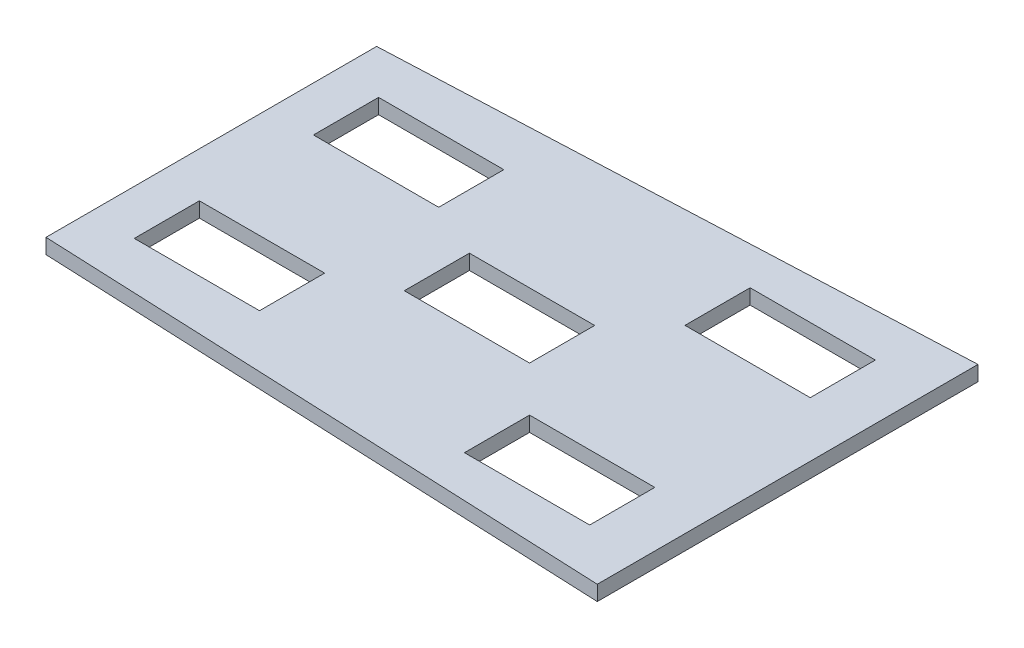
ISO-10303-21;
HEADER;
FILE_DESCRIPTION(('STEP AP214'),'2;1');
FILE_NAME('part.step','',(''),(''),'','','');
FILE_SCHEMA(('AUTOMOTIVE_DESIGN { 1 0 10303 214 1 1 1 1 }'));
ENDSEC;
DATA;
#1=APPLICATION_CONTEXT('core data for automotive mechanical design processes');
#2=APPLICATION_PROTOCOL_DEFINITION('international standard','automotive_design',2000,#1);
#3=PRODUCT_CONTEXT('',#1,'mechanical');
#4=PRODUCT('Part','Part','',(#3));
#5=PRODUCT_RELATED_PRODUCT_CATEGORY('part','',(#4));
#6=PRODUCT_DEFINITION_FORMATION('','',#4);
#7=PRODUCT_DEFINITION_CONTEXT('part definition',#1,'design');
#8=PRODUCT_DEFINITION('design','',#6,#7);
#9=PRODUCT_DEFINITION_SHAPE('','',#8);
#10=(LENGTH_UNIT() NAMED_UNIT(*) SI_UNIT(.MILLI.,.METRE.));
#11=(NAMED_UNIT(*) PLANE_ANGLE_UNIT() SI_UNIT($,.RADIAN.));
#12=(NAMED_UNIT(*) SI_UNIT($,.STERADIAN.) SOLID_ANGLE_UNIT());
#13=UNCERTAINTY_MEASURE_WITH_UNIT(LENGTH_MEASURE(1.E-05),#10,'distance_accuracy_value','');
#14=(GEOMETRIC_REPRESENTATION_CONTEXT(3) GLOBAL_UNCERTAINTY_ASSIGNED_CONTEXT((#13)) GLOBAL_UNIT_ASSIGNED_CONTEXT((#10,
#11,#12)) REPRESENTATION_CONTEXT('',''));
#15=CARTESIAN_POINT('',(0.,0.,0.));
#16=DIRECTION('',(0.,0.,1.));
#17=DIRECTION('',(1.,0.,0.));
#18=AXIS2_PLACEMENT_3D('',#15,#16,#17);
#19=CARTESIAN_POINT('',(57.5,3.,37.976345809204));
#20=DIRECTION('',(-1.,0.,0.));
#21=DIRECTION('',(0.,0.,1.));
#22=AXIS2_PLACEMENT_3D('',#19,#20,#21);
#23=PLANE('',#22);
#24=DIRECTION('',(0.,0.,-1.));
#25=VECTOR('',#24,1.);
#26=CARTESIAN_POINT('',(57.5,0.,37.976345809204));
#27=LINE('',#26,#25);
#28=CARTESIAN_POINT('',(57.5,0.,37.976345809204));
#29=VERTEX_POINT('',#28);
#30=CARTESIAN_POINT('',(57.5,0.,-38.023654190796));
#31=VERTEX_POINT('',#30);
#32=EDGE_CURVE('E354',#29,#31,#27,.T.);
#33=ORIENTED_EDGE('',*,*,#32,.T.);
#34=DIRECTION('',(0.,-1.,0.));
#35=VECTOR('',#34,1.);
#36=CARTESIAN_POINT('',(57.5,3.,-38.023654190796));
#37=LINE('',#36,#35);
#38=CARTESIAN_POINT('',(57.5,3.,-38.023654190796));
#39=VERTEX_POINT('',#38);
#40=EDGE_CURVE('E11',#39,#31,#37,.T.);
#41=ORIENTED_EDGE('',*,*,#40,.F.);
#42=DIRECTION('',(0.,0.,-1.));
#43=VECTOR('',#42,1.);
#44=CARTESIAN_POINT('',(57.5,3.,37.976345809204));
#45=LINE('',#44,#43);
#46=CARTESIAN_POINT('',(57.5,3.,37.976345809204));
#47=VERTEX_POINT('',#46);
#48=EDGE_CURVE('E361',#47,#39,#45,.T.);
#49=ORIENTED_EDGE('',*,*,#48,.F.);
#50=DIRECTION('',(0.,-1.,0.));
#51=VECTOR('',#50,1.);
#52=CARTESIAN_POINT('',(57.5,3.,37.976345809204));
#53=LINE('',#52,#51);
#54=EDGE_CURVE('E371',#47,#29,#53,.T.);
#55=ORIENTED_EDGE('',*,*,#54,.T.);
#56=EDGE_LOOP('',(#33,#41,#49,#55));
#57=FACE_BOUND('',#56,.T.);
#58=ADVANCED_FACE('F33',(#57),#23,.F.);
#59=CARTESIAN_POINT('',(-57.5,3.,-32.976345809204));
#60=DIRECTION('',(0.0438474267625696,0.,0.999038239091128));
#61=DIRECTION('',(0.999038239091128,0.,-0.0438474267625696));
#62=AXIS2_PLACEMENT_3D('',#59,#60,#61);
#63=PLANE('',#62);
#64=DIRECTION('',(-0.999038239091128,0.,0.0438474267625696));
#65=VECTOR('',#64,1.);
#66=CARTESIAN_POINT('',(-57.5,0.,-32.976345809204));
#67=LINE('',#66,#65);
#68=CARTESIAN_POINT('',(-57.5,0.,-32.976345809204));
#69=VERTEX_POINT('',#68);
#70=EDGE_CURVE('E374',#31,#69,#67,.T.);
#71=ORIENTED_EDGE('',*,*,#70,.T.);
#72=DIRECTION('',(0.,-1.,0.));
#73=VECTOR('',#72,1.);
#74=CARTESIAN_POINT('',(-57.5,3.,-32.976345809204));
#75=LINE('',#74,#73);
#76=CARTESIAN_POINT('',(-57.5,3.,-32.976345809204));
#77=VERTEX_POINT('',#76);
#78=EDGE_CURVE('E40',#77,#69,#75,.T.);
#79=ORIENTED_EDGE('',*,*,#78,.F.);
#80=DIRECTION('',(-0.999038239091128,0.,0.0438474267625696));
#81=VECTOR('',#80,1.);
#82=CARTESIAN_POINT('',(-57.5,3.,-32.976345809204));
#83=LINE('',#82,#81);
#84=EDGE_CURVE('E364',#39,#77,#83,.T.);
#85=ORIENTED_EDGE('',*,*,#84,.F.);
#86=ORIENTED_EDGE('',*,*,#40,.T.);
#87=EDGE_LOOP('',(#71,#79,#85,#86));
#88=FACE_BOUND('',#87,.T.);
#89=ADVANCED_FACE('F403',(#88),#63,.F.);
#90=CARTESIAN_POINT('',(-57.5,3.,33.023654190796));
#91=DIRECTION('',(1.,0.,0.));
#92=DIRECTION('',(0.,0.,-1.));
#93=AXIS2_PLACEMENT_3D('',#90,#91,#92);
#94=PLANE('',#93);
#95=DIRECTION('',(0.,0.,1.));
#96=VECTOR('',#95,1.);
#97=CARTESIAN_POINT('',(-57.5,0.,33.023654190796));
#98=LINE('',#97,#96);
#99=CARTESIAN_POINT('',(-57.5,0.,33.023654190796));
#100=VERTEX_POINT('',#99);
#101=EDGE_CURVE('E376',#69,#100,#98,.T.);
#102=ORIENTED_EDGE('',*,*,#101,.T.);
#103=DIRECTION('',(0.,-1.,0.));
#104=VECTOR('',#103,1.);
#105=CARTESIAN_POINT('',(-57.5,3.,33.023654190796));
#106=LINE('',#105,#104);
#107=CARTESIAN_POINT('',(-57.5,3.,33.023654190796));
#108=VERTEX_POINT('',#107);
#109=EDGE_CURVE('E381',#108,#100,#106,.T.);
#110=ORIENTED_EDGE('',*,*,#109,.F.);
#111=DIRECTION('',(0.,0.,1.));
#112=VECTOR('',#111,1.);
#113=CARTESIAN_POINT('',(-57.5,3.,33.023654190796));
#114=LINE('',#113,#112);
#115=EDGE_CURVE('E367',#77,#108,#114,.T.);
#116=ORIENTED_EDGE('',*,*,#115,.F.);
#117=ORIENTED_EDGE('',*,*,#78,.T.);
#118=EDGE_LOOP('',(#102,#110,#116,#117));
#119=FACE_BOUND('',#118,.T.);
#120=ADVANCED_FACE('F388',(#119),#94,.F.);
#121=CARTESIAN_POINT('',(-57.5,3.,33.023654190796));
#122=DIRECTION('',(0.0430269998203843,0.,-0.999073909821719));
#123=DIRECTION('',(-0.999073909821719,0.,-0.0430269998203843));
#124=AXIS2_PLACEMENT_3D('',#121,#122,#123);
#125=PLANE('',#124);
#126=DIRECTION('',(0.999073909821719,0.,0.0430269998203843));
#127=VECTOR('',#126,1.);
#128=CARTESIAN_POINT('',(-57.5,0.,33.023654190796));
#129=LINE('',#128,#127);
#130=EDGE_CURVE('E365',#100,#29,#129,.T.);
#131=ORIENTED_EDGE('',*,*,#130,.T.);
#132=ORIENTED_EDGE('',*,*,#54,.F.);
#133=DIRECTION('',(0.999073909821719,0.,0.0430269998203843));
#134=VECTOR('',#133,1.);
#135=CARTESIAN_POINT('',(-57.5,3.,33.023654190796));
#136=LINE('',#135,#134);
#137=EDGE_CURVE('E369',#108,#47,#136,.T.);
#138=ORIENTED_EDGE('',*,*,#137,.F.);
#139=ORIENTED_EDGE('',*,*,#109,.T.);
#140=EDGE_LOOP('',(#131,#132,#138,#139));
#141=FACE_BOUND('',#140,.T.);
#142=ADVANCED_FACE('F396',(#141),#125,.F.);
#143=CARTESIAN_POINT('',(0.,3.,0.));
#144=DIRECTION('',(0.,-1.,0.));
#145=DIRECTION('',(0.,0.,-1.));
#146=AXIS2_PLACEMENT_3D('',#143,#144,#145);
#147=PLANE('',#146);
#148=DIRECTION('',(-1.,0.,0.));
#149=VECTOR('',#148,1.);
#150=CARTESIAN_POINT('',(21.5,3.,-28.5322039906367));
#151=LINE('',#150,#149);
#152=CARTESIAN_POINT('',(46.5,3.,-28.5322039906367));
#153=VERTEX_POINT('',#152);
#154=CARTESIAN_POINT('',(21.5,3.,-28.5322039906367));
#155=VERTEX_POINT('',#154);
#156=EDGE_CURVE('E315',#153,#155,#151,.T.);
#157=ORIENTED_EDGE('',*,*,#156,.F.);
#158=DIRECTION('',(0.,0.,-1.));
#159=VECTOR('',#158,1.);
#160=CARTESIAN_POINT('',(46.5,3.,-15.5322039906367));
#161=LINE('',#160,#159);
#162=CARTESIAN_POINT('',(46.5,3.,-15.5322039906367));
#163=VERTEX_POINT('',#162);
#164=EDGE_CURVE('E47',#163,#153,#161,.T.);
#165=ORIENTED_EDGE('',*,*,#164,.F.);
#166=DIRECTION('',(1.,0.,0.));
#167=VECTOR('',#166,1.);
#168=CARTESIAN_POINT('',(21.5,3.,-15.5322039906367));
#169=LINE('',#168,#167);
#170=CARTESIAN_POINT('',(21.5,3.,-15.5322039906367));
#171=VERTEX_POINT('',#170);
#172=EDGE_CURVE('E304',#171,#163,#169,.T.);
#173=ORIENTED_EDGE('',*,*,#172,.F.);
#174=DIRECTION('',(0.,0.,1.));
#175=VECTOR('',#174,1.);
#176=CARTESIAN_POINT('',(21.5,3.,-15.5322039906367));
#177=LINE('',#176,#175);
#178=EDGE_CURVE('E318',#155,#171,#177,.T.);
#179=ORIENTED_EDGE('',*,*,#178,.F.);
#180=EDGE_LOOP('',(#157,#165,#173,#179));
#181=FACE_BOUND('',#180,.T.);
#182=DIRECTION('',(-1.,0.,0.));
#183=VECTOR('',#182,1.);
#184=CARTESIAN_POINT('',(-48.5,3.,-24.3626883710607));
#185=LINE('',#184,#183);
#186=CARTESIAN_POINT('',(-23.5,3.,-24.3626883710607));
#187=VERTEX_POINT('',#186);
#188=CARTESIAN_POINT('',(-48.5,3.,-24.3626883710607));
#189=VERTEX_POINT('',#188);
#190=EDGE_CURVE('E285',#187,#189,#185,.T.);
#191=ORIENTED_EDGE('',*,*,#190,.F.);
#192=DIRECTION('',(0.,0.,-1.));
#193=VECTOR('',#192,1.);
#194=CARTESIAN_POINT('',(-23.5,3.,-11.3626883710607));
#195=LINE('',#194,#193);
#196=CARTESIAN_POINT('',(-23.5,3.,-11.3626883710607));
#197=VERTEX_POINT('',#196);
#198=EDGE_CURVE('E55',#197,#187,#195,.T.);
#199=ORIENTED_EDGE('',*,*,#198,.F.);
#200=DIRECTION('',(1.,0.,0.));
#201=VECTOR('',#200,1.);
#202=CARTESIAN_POINT('',(-48.5,3.,-11.3626883710607));
#203=LINE('',#202,#201);
#204=CARTESIAN_POINT('',(-48.5,3.,-11.3626883710607));
#205=VERTEX_POINT('',#204);
#206=EDGE_CURVE('E274',#205,#197,#203,.T.);
#207=ORIENTED_EDGE('',*,*,#206,.F.);
#208=DIRECTION('',(0.,0.,1.));
#209=VECTOR('',#208,1.);
#210=CARTESIAN_POINT('',(-48.5,3.,-11.3626883710607));
#211=LINE('',#210,#209);
#212=EDGE_CURVE('E289',#189,#205,#211,.T.);
#213=ORIENTED_EDGE('',*,*,#212,.F.);
#214=EDGE_LOOP('',(#191,#199,#207,#213));
#215=FACE_BOUND('',#214,.T.);
#216=DIRECTION('',(-1.,0.,0.));
#217=VECTOR('',#216,1.);
#218=CARTESIAN_POINT('',(-48.5,3.,11.4029136059943));
#219=LINE('',#218,#217);
#220=CARTESIAN_POINT('',(-23.5,3.,11.4029136059943));
#221=VERTEX_POINT('',#220);
#222=CARTESIAN_POINT('',(-48.5,3.,11.4029136059943));
#223=VERTEX_POINT('',#222);
#224=EDGE_CURVE('E254',#221,#223,#219,.T.);
#225=ORIENTED_EDGE('',*,*,#224,.F.);
#226=DIRECTION('',(0.,0.,-1.));
#227=VECTOR('',#226,1.);
#228=CARTESIAN_POINT('',(-23.5,3.,11.4029136059943));
#229=LINE('',#228,#227);
#230=CARTESIAN_POINT('',(-23.5,3.,24.4029136059943));
#231=VERTEX_POINT('',#230);
#232=EDGE_CURVE('E252',#231,#221,#229,.T.);
#233=ORIENTED_EDGE('',*,*,#232,.F.);
#234=DIRECTION('',(1.,0.,0.));
#235=VECTOR('',#234,1.);
#236=CARTESIAN_POINT('',(-48.5,3.,24.4029136059943));
#237=LINE('',#236,#235);
#238=CARTESIAN_POINT('',(-48.5,3.,24.4029136059943));
#239=VERTEX_POINT('',#238);
#240=EDGE_CURVE('E242',#239,#231,#237,.T.);
#241=ORIENTED_EDGE('',*,*,#240,.F.);
#242=DIRECTION('',(0.,0.,1.));
#243=VECTOR('',#242,1.);
#244=CARTESIAN_POINT('',(-48.5,3.,11.4029136059943));
#245=LINE('',#244,#243);
#246=EDGE_CURVE('E258',#223,#239,#245,.T.);
#247=ORIENTED_EDGE('',*,*,#246,.F.);
#248=EDGE_LOOP('',(#225,#233,#241,#247));
#249=FACE_BOUND('',#248,.T.);
#250=DIRECTION('',(-1.,0.,0.));
#251=VECTOR('',#250,1.);
#252=CARTESIAN_POINT('',(-12.5,3.,-6.5));
#253=LINE('',#252,#251);
#254=CARTESIAN_POINT('',(12.5,3.,-6.5));
#255=VERTEX_POINT('',#254);
#256=CARTESIAN_POINT('',(-12.5,3.,-6.5));
#257=VERTEX_POINT('',#256);
#258=EDGE_CURVE('E227',#255,#257,#253,.T.);
#259=ORIENTED_EDGE('',*,*,#258,.F.);
#260=DIRECTION('',(0.,0.,-1.));
#261=VECTOR('',#260,1.);
#262=CARTESIAN_POINT('',(12.5,3.,-6.5));
#263=LINE('',#262,#261);
#264=CARTESIAN_POINT('',(12.5,3.,6.5));
#265=VERTEX_POINT('',#264);
#266=EDGE_CURVE('E200',#265,#255,#263,.T.);
#267=ORIENTED_EDGE('',*,*,#266,.F.);
#268=DIRECTION('',(1.,0.,0.));
#269=VECTOR('',#268,1.);
#270=CARTESIAN_POINT('',(-12.5,3.,6.5));
#271=LINE('',#270,#269);
#272=CARTESIAN_POINT('',(-12.5,3.,6.5));
#273=VERTEX_POINT('',#272);
#274=EDGE_CURVE('E218',#273,#265,#271,.T.);
#275=ORIENTED_EDGE('',*,*,#274,.F.);
#276=DIRECTION('',(0.,0.,1.));
#277=VECTOR('',#276,1.);
#278=CARTESIAN_POINT('',(-12.5,3.,-6.5));
#279=LINE('',#278,#277);
#280=EDGE_CURVE('E221',#257,#273,#279,.T.);
#281=ORIENTED_EDGE('',*,*,#280,.F.);
#282=EDGE_LOOP('',(#259,#267,#275,#281));
#283=FACE_BOUND('',#282,.T.);
#284=DIRECTION('',(-1.,0.,0.));
#285=VECTOR('',#284,1.);
#286=CARTESIAN_POINT('',(21.5,3.,15.4942675516358));
#287=LINE('',#286,#285);
#288=CARTESIAN_POINT('',(46.5,3.,15.4942675516358));
#289=VERTEX_POINT('',#288);
#290=CARTESIAN_POINT('',(21.5,3.,15.4942675516358));
#291=VERTEX_POINT('',#290);
#292=EDGE_CURVE('E344',#289,#291,#287,.T.);
#293=ORIENTED_EDGE('',*,*,#292,.F.);
#294=DIRECTION('',(0.,0.,-1.));
#295=VECTOR('',#294,1.);
#296=CARTESIAN_POINT('',(46.5,3.,15.4942675516358));
#297=LINE('',#296,#295);
#298=CARTESIAN_POINT('',(46.5,3.,28.4942675516358));
#299=VERTEX_POINT('',#298);
#300=EDGE_CURVE('E234',#299,#289,#297,.T.);
#301=ORIENTED_EDGE('',*,*,#300,.F.);
#302=DIRECTION('',(1.,0.,0.));
#303=VECTOR('',#302,1.);
#304=CARTESIAN_POINT('',(21.5,3.,28.4942675516358));
#305=LINE('',#304,#303);
#306=CARTESIAN_POINT('',(21.5,3.,28.4942675516358));
#307=VERTEX_POINT('',#306);
#308=EDGE_CURVE('E333',#307,#299,#305,.T.);
#309=ORIENTED_EDGE('',*,*,#308,.F.);
#310=DIRECTION('',(0.,0.,1.));
#311=VECTOR('',#310,1.);
#312=CARTESIAN_POINT('',(21.5,3.,15.4942675516358));
#313=LINE('',#312,#311);
#314=EDGE_CURVE('E347',#291,#307,#313,.T.);
#315=ORIENTED_EDGE('',*,*,#314,.F.);
#316=EDGE_LOOP('',(#293,#301,#309,#315));
#317=FACE_BOUND('',#316,.T.);
#318=ORIENTED_EDGE('',*,*,#48,.T.);
#319=ORIENTED_EDGE('',*,*,#84,.T.);
#320=ORIENTED_EDGE('',*,*,#115,.T.);
#321=ORIENTED_EDGE('',*,*,#137,.T.);
#322=EDGE_LOOP('',(#318,#319,#320,#321));
#323=FACE_BOUND('',#322,.T.);
#324=ADVANCED_FACE('F402',(#181,#215,#249,#283,#317,#323),#147,.F.);
#325=CARTESIAN_POINT('',(0.,0.,0.));
#326=DIRECTION('',(0.,-1.,0.));
#327=DIRECTION('',(0.,0.,-1.));
#328=AXIS2_PLACEMENT_3D('',#325,#326,#327);
#329=PLANE('',#328);
#330=DIRECTION('',(0.,0.,-1.));
#331=VECTOR('',#330,1.);
#332=CARTESIAN_POINT('',(46.5,0.,-15.5322039906367));
#333=LINE('',#332,#331);
#334=CARTESIAN_POINT('',(46.5,0.,-15.5322039906367));
#335=VERTEX_POINT('',#334);
#336=CARTESIAN_POINT('',(46.5,0.,-28.5322039906367));
#337=VERTEX_POINT('',#336);
#338=EDGE_CURVE('E300',#335,#337,#333,.T.);
#339=ORIENTED_EDGE('',*,*,#338,.T.);
#340=DIRECTION('',(-1.,0.,0.));
#341=VECTOR('',#340,1.);
#342=CARTESIAN_POINT('',(21.5,0.,-28.5322039906367));
#343=LINE('',#342,#341);
#344=CARTESIAN_POINT('',(21.5,0.,-28.5322039906367));
#345=VERTEX_POINT('',#344);
#346=EDGE_CURVE('E303',#337,#345,#343,.T.);
#347=ORIENTED_EDGE('',*,*,#346,.T.);
#348=DIRECTION('',(0.,0.,1.));
#349=VECTOR('',#348,1.);
#350=CARTESIAN_POINT('',(21.5,0.,-15.5322039906367));
#351=LINE('',#350,#349);
#352=CARTESIAN_POINT('',(21.5,0.,-15.5322039906367));
#353=VERTEX_POINT('',#352);
#354=EDGE_CURVE('E307',#345,#353,#351,.T.);
#355=ORIENTED_EDGE('',*,*,#354,.T.);
#356=DIRECTION('',(1.,0.,0.));
#357=VECTOR('',#356,1.);
#358=CARTESIAN_POINT('',(21.5,0.,-15.5322039906367));
#359=LINE('',#358,#357);
#360=EDGE_CURVE('E310',#353,#335,#359,.T.);
#361=ORIENTED_EDGE('',*,*,#360,.T.);
#362=EDGE_LOOP('',(#339,#347,#355,#361));
#363=FACE_BOUND('',#362,.T.);
#364=DIRECTION('',(0.,0.,-1.));
#365=VECTOR('',#364,1.);
#366=CARTESIAN_POINT('',(-23.5,0.,-11.3626883710607));
#367=LINE('',#366,#365);
#368=CARTESIAN_POINT('',(-23.5,0.,-11.3626883710607));
#369=VERTEX_POINT('',#368);
#370=CARTESIAN_POINT('',(-23.5,0.,-24.3626883710607));
#371=VERTEX_POINT('',#370);
#372=EDGE_CURVE('E270',#369,#371,#367,.T.);
#373=ORIENTED_EDGE('',*,*,#372,.T.);
#374=DIRECTION('',(-1.,0.,0.));
#375=VECTOR('',#374,1.);
#376=CARTESIAN_POINT('',(-48.5,0.,-24.3626883710607));
#377=LINE('',#376,#375);
#378=CARTESIAN_POINT('',(-48.5,0.,-24.3626883710607));
#379=VERTEX_POINT('',#378);
#380=EDGE_CURVE('E273',#371,#379,#377,.T.);
#381=ORIENTED_EDGE('',*,*,#380,.T.);
#382=DIRECTION('',(0.,0.,1.));
#383=VECTOR('',#382,1.);
#384=CARTESIAN_POINT('',(-48.5,0.,-11.3626883710607));
#385=LINE('',#384,#383);
#386=CARTESIAN_POINT('',(-48.5,0.,-11.3626883710607));
#387=VERTEX_POINT('',#386);
#388=EDGE_CURVE('E277',#379,#387,#385,.T.);
#389=ORIENTED_EDGE('',*,*,#388,.T.);
#390=DIRECTION('',(1.,0.,0.));
#391=VECTOR('',#390,1.);
#392=CARTESIAN_POINT('',(-48.5,0.,-11.3626883710607));
#393=LINE('',#392,#391);
#394=EDGE_CURVE('E280',#387,#369,#393,.T.);
#395=ORIENTED_EDGE('',*,*,#394,.T.);
#396=EDGE_LOOP('',(#373,#381,#389,#395));
#397=FACE_BOUND('',#396,.T.);
#398=DIRECTION('',(0.,0.,-1.));
#399=VECTOR('',#398,1.);
#400=CARTESIAN_POINT('',(-23.5,0.,11.4029136059943));
#401=LINE('',#400,#399);
#402=CARTESIAN_POINT('',(-23.5,0.,24.4029136059943));
#403=VERTEX_POINT('',#402);
#404=CARTESIAN_POINT('',(-23.5,0.,11.4029136059943));
#405=VERTEX_POINT('',#404);
#406=EDGE_CURVE('E238',#403,#405,#401,.T.);
#407=ORIENTED_EDGE('',*,*,#406,.T.);
#408=DIRECTION('',(-1.,0.,0.));
#409=VECTOR('',#408,1.);
#410=CARTESIAN_POINT('',(-48.5,0.,11.4029136059943));
#411=LINE('',#410,#409);
#412=CARTESIAN_POINT('',(-48.5,0.,11.4029136059943));
#413=VERTEX_POINT('',#412);
#414=EDGE_CURVE('E241',#405,#413,#411,.T.);
#415=ORIENTED_EDGE('',*,*,#414,.T.);
#416=DIRECTION('',(0.,0.,1.));
#417=VECTOR('',#416,1.);
#418=CARTESIAN_POINT('',(-48.5,0.,11.4029136059943));
#419=LINE('',#418,#417);
#420=CARTESIAN_POINT('',(-48.5,0.,24.4029136059943));
#421=VERTEX_POINT('',#420);
#422=EDGE_CURVE('E245',#413,#421,#419,.T.);
#423=ORIENTED_EDGE('',*,*,#422,.T.);
#424=DIRECTION('',(1.,0.,0.));
#425=VECTOR('',#424,1.);
#426=CARTESIAN_POINT('',(-48.5,0.,24.4029136059943));
#427=LINE('',#426,#425);
#428=EDGE_CURVE('E248',#421,#403,#427,.T.);
#429=ORIENTED_EDGE('',*,*,#428,.T.);
#430=EDGE_LOOP('',(#407,#415,#423,#429));
#431=FACE_BOUND('',#430,.T.);
#432=DIRECTION('',(0.,0.,-1.));
#433=VECTOR('',#432,1.);
#434=CARTESIAN_POINT('',(12.5,0.,-6.5));
#435=LINE('',#434,#433);
#436=CARTESIAN_POINT('',(12.5,0.,6.5));
#437=VERTEX_POINT('',#436);
#438=CARTESIAN_POINT('',(12.5,0.,-6.5));
#439=VERTEX_POINT('',#438);
#440=EDGE_CURVE('E197',#437,#439,#435,.T.);
#441=ORIENTED_EDGE('',*,*,#440,.T.);
#442=DIRECTION('',(-1.,0.,0.));
#443=VECTOR('',#442,1.);
#444=CARTESIAN_POINT('',(-12.5,0.,-6.5));
#445=LINE('',#444,#443);
#446=CARTESIAN_POINT('',(-12.5,0.,-6.5));
#447=VERTEX_POINT('',#446);
#448=EDGE_CURVE('E209',#439,#447,#445,.T.);
#449=ORIENTED_EDGE('',*,*,#448,.T.);
#450=DIRECTION('',(0.,0.,1.));
#451=VECTOR('',#450,1.);
#452=CARTESIAN_POINT('',(-12.5,0.,-6.5));
#453=LINE('',#452,#451);
#454=CARTESIAN_POINT('',(-12.5,0.,6.5));
#455=VERTEX_POINT('',#454);
#456=EDGE_CURVE('E213',#447,#455,#453,.T.);
#457=ORIENTED_EDGE('',*,*,#456,.T.);
#458=DIRECTION('',(1.,0.,0.));
#459=VECTOR('',#458,1.);
#460=CARTESIAN_POINT('',(-12.5,0.,6.5));
#461=LINE('',#460,#459);
#462=EDGE_CURVE('E205',#455,#437,#461,.T.);
#463=ORIENTED_EDGE('',*,*,#462,.T.);
#464=EDGE_LOOP('',(#441,#449,#457,#463));
#465=FACE_BOUND('',#464,.T.);
#466=DIRECTION('',(0.,0.,-1.));
#467=VECTOR('',#466,1.);
#468=CARTESIAN_POINT('',(46.5,0.,15.4942675516358));
#469=LINE('',#468,#467);
#470=CARTESIAN_POINT('',(46.5,0.,28.4942675516358));
#471=VERTEX_POINT('',#470);
#472=CARTESIAN_POINT('',(46.5,0.,15.4942675516358));
#473=VERTEX_POINT('',#472);
#474=EDGE_CURVE('E329',#471,#473,#469,.T.);
#475=ORIENTED_EDGE('',*,*,#474,.T.);
#476=DIRECTION('',(-1.,0.,0.));
#477=VECTOR('',#476,1.);
#478=CARTESIAN_POINT('',(21.5,0.,15.4942675516358));
#479=LINE('',#478,#477);
#480=CARTESIAN_POINT('',(21.5,0.,15.4942675516358));
#481=VERTEX_POINT('',#480);
#482=EDGE_CURVE('E332',#473,#481,#479,.T.);
#483=ORIENTED_EDGE('',*,*,#482,.T.);
#484=DIRECTION('',(0.,0.,1.));
#485=VECTOR('',#484,1.);
#486=CARTESIAN_POINT('',(21.5,0.,15.4942675516358));
#487=LINE('',#486,#485);
#488=CARTESIAN_POINT('',(21.5,0.,28.4942675516358));
#489=VERTEX_POINT('',#488);
#490=EDGE_CURVE('E336',#481,#489,#487,.T.);
#491=ORIENTED_EDGE('',*,*,#490,.T.);
#492=DIRECTION('',(1.,0.,0.));
#493=VECTOR('',#492,1.);
#494=CARTESIAN_POINT('',(21.5,0.,28.4942675516358));
#495=LINE('',#494,#493);
#496=EDGE_CURVE('E339',#489,#471,#495,.T.);
#497=ORIENTED_EDGE('',*,*,#496,.T.);
#498=EDGE_LOOP('',(#475,#483,#491,#497));
#499=FACE_BOUND('',#498,.T.);
#500=ORIENTED_EDGE('',*,*,#32,.F.);
#501=ORIENTED_EDGE('',*,*,#130,.F.);
#502=ORIENTED_EDGE('',*,*,#101,.F.);
#503=ORIENTED_EDGE('',*,*,#70,.F.);
#504=EDGE_LOOP('',(#500,#501,#502,#503));
#505=FACE_BOUND('',#504,.T.);
#506=ADVANCED_FACE('F215',(#363,#397,#431,#465,#499,#505),#329,.T.);
#507=CARTESIAN_POINT('',(46.5,0.,15.4942675516358));
#508=DIRECTION('',(1.,0.,0.));
#509=DIRECTION('',(0.,0.,-1.));
#510=AXIS2_PLACEMENT_3D('',#507,#508,#509);
#511=PLANE('',#510);
#512=ORIENTED_EDGE('',*,*,#300,.T.);
#513=DIRECTION('',(0.,1.,0.));
#514=VECTOR('',#513,1.);
#515=CARTESIAN_POINT('',(46.5,0.,15.4942675516358));
#516=LINE('',#515,#514);
#517=EDGE_CURVE('E342',#473,#289,#516,.T.);
#518=ORIENTED_EDGE('',*,*,#517,.F.);
#519=ORIENTED_EDGE('',*,*,#474,.F.);
#520=DIRECTION('',(0.,1.,0.));
#521=VECTOR('',#520,1.);
#522=CARTESIAN_POINT('',(46.5,0.,28.4942675516358));
#523=LINE('',#522,#521);
#524=EDGE_CURVE('E352',#471,#299,#523,.T.);
#525=ORIENTED_EDGE('',*,*,#524,.T.);
#526=EDGE_LOOP('',(#512,#518,#519,#525));
#527=FACE_BOUND('',#526,.T.);
#528=ADVANCED_FACE('F415',(#527),#511,.F.);
#529=CARTESIAN_POINT('',(21.5,0.,28.4942675516358));
#530=DIRECTION('',(0.,0.,1.));
#531=DIRECTION('',(1.,0.,0.));
#532=AXIS2_PLACEMENT_3D('',#529,#530,#531);
#533=PLANE('',#532);
#534=ORIENTED_EDGE('',*,*,#308,.T.);
#535=ORIENTED_EDGE('',*,*,#524,.F.);
#536=ORIENTED_EDGE('',*,*,#496,.F.);
#537=DIRECTION('',(0.,1.,0.));
#538=VECTOR('',#537,1.);
#539=CARTESIAN_POINT('',(21.5,0.,28.4942675516358));
#540=LINE('',#539,#538);
#541=EDGE_CURVE('E355',#489,#307,#540,.T.);
#542=ORIENTED_EDGE('',*,*,#541,.T.);
#543=EDGE_LOOP('',(#534,#535,#536,#542));
#544=FACE_BOUND('',#543,.T.);
#545=ADVANCED_FACE('F422',(#544),#533,.F.);
#546=CARTESIAN_POINT('',(21.5,0.,15.4942675516358));
#547=DIRECTION('',(-1.,0.,0.));
#548=DIRECTION('',(0.,0.,1.));
#549=AXIS2_PLACEMENT_3D('',#546,#547,#548);
#550=PLANE('',#549);
#551=ORIENTED_EDGE('',*,*,#314,.T.);
#552=ORIENTED_EDGE('',*,*,#541,.F.);
#553=ORIENTED_EDGE('',*,*,#490,.F.);
#554=DIRECTION('',(0.,1.,0.));
#555=VECTOR('',#554,1.);
#556=CARTESIAN_POINT('',(21.5,0.,15.4942675516358));
#557=LINE('',#556,#555);
#558=EDGE_CURVE('E357',#481,#291,#557,.T.);
#559=ORIENTED_EDGE('',*,*,#558,.T.);
#560=EDGE_LOOP('',(#551,#552,#553,#559));
#561=FACE_BOUND('',#560,.T.);
#562=ADVANCED_FACE('F427',(#561),#550,.F.);
#563=CARTESIAN_POINT('',(21.5,0.,15.4942675516358));
#564=DIRECTION('',(0.,0.,-1.));
#565=DIRECTION('',(-1.,0.,0.));
#566=AXIS2_PLACEMENT_3D('',#563,#564,#565);
#567=PLANE('',#566);
#568=ORIENTED_EDGE('',*,*,#292,.T.);
#569=ORIENTED_EDGE('',*,*,#558,.F.);
#570=ORIENTED_EDGE('',*,*,#482,.F.);
#571=ORIENTED_EDGE('',*,*,#517,.T.);
#572=EDGE_LOOP('',(#568,#569,#570,#571));
#573=FACE_BOUND('',#572,.T.);
#574=ADVANCED_FACE('F424',(#573),#567,.F.);
#575=CARTESIAN_POINT('',(12.5,0.,-6.5));
#576=DIRECTION('',(1.,0.,0.));
#577=DIRECTION('',(0.,0.,-1.));
#578=AXIS2_PLACEMENT_3D('',#575,#576,#577);
#579=PLANE('',#578);
#580=ORIENTED_EDGE('',*,*,#266,.T.);
#581=DIRECTION('',(0.,1.,0.));
#582=VECTOR('',#581,1.);
#583=CARTESIAN_POINT('',(12.5,0.,-6.5));
#584=LINE('',#583,#582);
#585=EDGE_CURVE('E193',#439,#255,#584,.T.);
#586=ORIENTED_EDGE('',*,*,#585,.F.);
#587=ORIENTED_EDGE('',*,*,#440,.F.);
#588=DIRECTION('',(0.,1.,0.));
#589=VECTOR('',#588,1.);
#590=CARTESIAN_POINT('',(12.5,0.,6.5));
#591=LINE('',#590,#589);
#592=EDGE_CURVE('E232',#437,#265,#591,.T.);
#593=ORIENTED_EDGE('',*,*,#592,.T.);
#594=EDGE_LOOP('',(#580,#586,#587,#593));
#595=FACE_BOUND('',#594,.T.);
#596=ADVANCED_FACE('F195',(#595),#579,.F.);
#597=CARTESIAN_POINT('',(-12.5,0.,6.5));
#598=DIRECTION('',(0.,0.,1.));
#599=DIRECTION('',(1.,0.,0.));
#600=AXIS2_PLACEMENT_3D('',#597,#598,#599);
#601=PLANE('',#600);
#602=ORIENTED_EDGE('',*,*,#274,.T.);
#603=ORIENTED_EDGE('',*,*,#592,.F.);
#604=ORIENTED_EDGE('',*,*,#462,.F.);
#605=DIRECTION('',(0.,1.,0.));
#606=VECTOR('',#605,1.);
#607=CARTESIAN_POINT('',(-12.5,0.,6.5));
#608=LINE('',#607,#606);
#609=EDGE_CURVE('E235',#455,#273,#608,.T.);
#610=ORIENTED_EDGE('',*,*,#609,.T.);
#611=EDGE_LOOP('',(#602,#603,#604,#610));
#612=FACE_BOUND('',#611,.T.);
#613=ADVANCED_FACE('F483',(#612),#601,.F.);
#614=CARTESIAN_POINT('',(-12.5,0.,-6.5));
#615=DIRECTION('',(-1.,0.,0.));
#616=DIRECTION('',(0.,0.,1.));
#617=AXIS2_PLACEMENT_3D('',#614,#615,#616);
#618=PLANE('',#617);
#619=ORIENTED_EDGE('',*,*,#280,.T.);
#620=ORIENTED_EDGE('',*,*,#609,.F.);
#621=ORIENTED_EDGE('',*,*,#456,.F.);
#622=DIRECTION('',(0.,1.,0.));
#623=VECTOR('',#622,1.);
#624=CARTESIAN_POINT('',(-12.5,0.,-6.5));
#625=LINE('',#624,#623);
#626=EDGE_CURVE('E204',#447,#257,#625,.T.);
#627=ORIENTED_EDGE('',*,*,#626,.T.);
#628=EDGE_LOOP('',(#619,#620,#621,#627));
#629=FACE_BOUND('',#628,.T.);
#630=ADVANCED_FACE('F486',(#629),#618,.F.);
#631=CARTESIAN_POINT('',(-12.5,0.,-6.5));
#632=DIRECTION('',(0.,0.,-1.));
#633=DIRECTION('',(-1.,0.,0.));
#634=AXIS2_PLACEMENT_3D('',#631,#632,#633);
#635=PLANE('',#634);
#636=ORIENTED_EDGE('',*,*,#258,.T.);
#637=ORIENTED_EDGE('',*,*,#626,.F.);
#638=ORIENTED_EDGE('',*,*,#448,.F.);
#639=ORIENTED_EDGE('',*,*,#585,.T.);
#640=EDGE_LOOP('',(#636,#637,#638,#639));
#641=FACE_BOUND('',#640,.T.);
#642=ADVANCED_FACE('F210',(#641),#635,.F.);
#643=CARTESIAN_POINT('',(-23.5,0.,11.4029136059943));
#644=DIRECTION('',(1.,0.,0.));
#645=DIRECTION('',(0.,0.,-1.));
#646=AXIS2_PLACEMENT_3D('',#643,#644,#645);
#647=PLANE('',#646);
#648=ORIENTED_EDGE('',*,*,#232,.T.);
#649=DIRECTION('',(0.,1.,0.));
#650=VECTOR('',#649,1.);
#651=CARTESIAN_POINT('',(-23.5,0.,11.4029136059943));
#652=LINE('',#651,#650);
#653=EDGE_CURVE('E251',#405,#221,#652,.T.);
#654=ORIENTED_EDGE('',*,*,#653,.F.);
#655=ORIENTED_EDGE('',*,*,#406,.F.);
#656=DIRECTION('',(0.,1.,0.));
#657=VECTOR('',#656,1.);
#658=CARTESIAN_POINT('',(-23.5,0.,24.4029136059943));
#659=LINE('',#658,#657);
#660=EDGE_CURVE('E228',#403,#231,#659,.T.);
#661=ORIENTED_EDGE('',*,*,#660,.T.);
#662=EDGE_LOOP('',(#648,#654,#655,#661));
#663=FACE_BOUND('',#662,.T.);
#664=ADVANCED_FACE('F466',(#663),#647,.F.);
#665=CARTESIAN_POINT('',(-48.5,0.,24.4029136059943));
#666=DIRECTION('',(0.,0.,1.));
#667=DIRECTION('',(1.,0.,0.));
#668=AXIS2_PLACEMENT_3D('',#665,#666,#667);
#669=PLANE('',#668);
#670=ORIENTED_EDGE('',*,*,#240,.T.);
#671=ORIENTED_EDGE('',*,*,#660,.F.);
#672=ORIENTED_EDGE('',*,*,#428,.F.);
#673=DIRECTION('',(0.,1.,0.));
#674=VECTOR('',#673,1.);
#675=CARTESIAN_POINT('',(-48.5,0.,24.4029136059943));
#676=LINE('',#675,#674);
#677=EDGE_CURVE('E264',#421,#239,#676,.T.);
#678=ORIENTED_EDGE('',*,*,#677,.T.);
#679=EDGE_LOOP('',(#670,#671,#672,#678));
#680=FACE_BOUND('',#679,.T.);
#681=ADVANCED_FACE('F469',(#680),#669,.F.);
#682=CARTESIAN_POINT('',(-48.5,0.,11.4029136059943));
#683=DIRECTION('',(-1.,0.,0.));
#684=DIRECTION('',(0.,0.,1.));
#685=AXIS2_PLACEMENT_3D('',#682,#683,#684);
#686=PLANE('',#685);
#687=ORIENTED_EDGE('',*,*,#246,.T.);
#688=ORIENTED_EDGE('',*,*,#677,.F.);
#689=ORIENTED_EDGE('',*,*,#422,.F.);
#690=DIRECTION('',(0.,1.,0.));
#691=VECTOR('',#690,1.);
#692=CARTESIAN_POINT('',(-48.5,0.,11.4029136059943));
#693=LINE('',#692,#691);
#694=EDGE_CURVE('E266',#413,#223,#693,.T.);
#695=ORIENTED_EDGE('',*,*,#694,.T.);
#696=EDGE_LOOP('',(#687,#688,#689,#695));
#697=FACE_BOUND('',#696,.T.);
#698=ADVANCED_FACE('F473',(#697),#686,.F.);
#699=CARTESIAN_POINT('',(-48.5,0.,11.4029136059943));
#700=DIRECTION('',(0.,0.,-1.));
#701=DIRECTION('',(-1.,0.,0.));
#702=AXIS2_PLACEMENT_3D('',#699,#700,#701);
#703=PLANE('',#702);
#704=ORIENTED_EDGE('',*,*,#224,.T.);
#705=ORIENTED_EDGE('',*,*,#694,.F.);
#706=ORIENTED_EDGE('',*,*,#414,.F.);
#707=ORIENTED_EDGE('',*,*,#653,.T.);
#708=EDGE_LOOP('',(#704,#705,#706,#707));
#709=FACE_BOUND('',#708,.T.);
#710=ADVANCED_FACE('F455',(#709),#703,.F.);
#711=CARTESIAN_POINT('',(-23.5,0.,-11.3626883710607));
#712=DIRECTION('',(1.,0.,0.));
#713=DIRECTION('',(0.,0.,-1.));
#714=AXIS2_PLACEMENT_3D('',#711,#712,#713);
#715=PLANE('',#714);
#716=ORIENTED_EDGE('',*,*,#198,.T.);
#717=DIRECTION('',(0.,1.,0.));
#718=VECTOR('',#717,1.);
#719=CARTESIAN_POINT('',(-23.5,0.,-24.3626883710607));
#720=LINE('',#719,#718);
#721=EDGE_CURVE('E283',#371,#187,#720,.T.);
#722=ORIENTED_EDGE('',*,*,#721,.F.);
#723=ORIENTED_EDGE('',*,*,#372,.F.);
#724=DIRECTION('',(0.,1.,0.));
#725=VECTOR('',#724,1.);
#726=CARTESIAN_POINT('',(-23.5,0.,-11.3626883710607));
#727=LINE('',#726,#725);
#728=EDGE_CURVE('E255',#369,#197,#727,.T.);
#729=ORIENTED_EDGE('',*,*,#728,.T.);
#730=EDGE_LOOP('',(#716,#722,#723,#729));
#731=FACE_BOUND('',#730,.T.);
#732=ADVANCED_FACE('F451',(#731),#715,.F.);
#733=CARTESIAN_POINT('',(-48.5,0.,-11.3626883710607));
#734=DIRECTION('',(0.,0.,1.));
#735=DIRECTION('',(1.,0.,0.));
#736=AXIS2_PLACEMENT_3D('',#733,#734,#735);
#737=PLANE('',#736);
#738=ORIENTED_EDGE('',*,*,#206,.T.);
#739=ORIENTED_EDGE('',*,*,#728,.F.);
#740=ORIENTED_EDGE('',*,*,#394,.F.);
#741=DIRECTION('',(0.,1.,0.));
#742=VECTOR('',#741,1.);
#743=CARTESIAN_POINT('',(-48.5,0.,-11.3626883710607));
#744=LINE('',#743,#742);
#745=EDGE_CURVE('E295',#387,#205,#744,.T.);
#746=ORIENTED_EDGE('',*,*,#745,.T.);
#747=EDGE_LOOP('',(#738,#739,#740,#746));
#748=FACE_BOUND('',#747,.T.);
#749=ADVANCED_FACE('F454',(#748),#737,.F.);
#750=CARTESIAN_POINT('',(-48.5,0.,-11.3626883710607));
#751=DIRECTION('',(-1.,0.,0.));
#752=DIRECTION('',(0.,0.,1.));
#753=AXIS2_PLACEMENT_3D('',#750,#751,#752);
#754=PLANE('',#753);
#755=ORIENTED_EDGE('',*,*,#212,.T.);
#756=ORIENTED_EDGE('',*,*,#745,.F.);
#757=ORIENTED_EDGE('',*,*,#388,.F.);
#758=DIRECTION('',(0.,1.,0.));
#759=VECTOR('',#758,1.);
#760=CARTESIAN_POINT('',(-48.5,0.,-24.3626883710607));
#761=LINE('',#760,#759);
#762=EDGE_CURVE('E297',#379,#189,#761,.T.);
#763=ORIENTED_EDGE('',*,*,#762,.T.);
#764=EDGE_LOOP('',(#755,#756,#757,#763));
#765=FACE_BOUND('',#764,.T.);
#766=ADVANCED_FACE('F458',(#765),#754,.F.);
#767=CARTESIAN_POINT('',(-48.5,0.,-24.3626883710607));
#768=DIRECTION('',(0.,0.,-1.));
#769=DIRECTION('',(-1.,0.,0.));
#770=AXIS2_PLACEMENT_3D('',#767,#768,#769);
#771=PLANE('',#770);
#772=ORIENTED_EDGE('',*,*,#190,.T.);
#773=ORIENTED_EDGE('',*,*,#762,.F.);
#774=ORIENTED_EDGE('',*,*,#380,.F.);
#775=ORIENTED_EDGE('',*,*,#721,.T.);
#776=EDGE_LOOP('',(#772,#773,#774,#775));
#777=FACE_BOUND('',#776,.T.);
#778=ADVANCED_FACE('F439',(#777),#771,.F.);
#779=CARTESIAN_POINT('',(46.5,0.,-15.5322039906367));
#780=DIRECTION('',(1.,0.,0.));
#781=DIRECTION('',(0.,0.,-1.));
#782=AXIS2_PLACEMENT_3D('',#779,#780,#781);
#783=PLANE('',#782);
#784=ORIENTED_EDGE('',*,*,#164,.T.);
#785=DIRECTION('',(0.,1.,0.));
#786=VECTOR('',#785,1.);
#787=CARTESIAN_POINT('',(46.5,0.,-28.5322039906367));
#788=LINE('',#787,#786);
#789=EDGE_CURVE('E313',#337,#153,#788,.T.);
#790=ORIENTED_EDGE('',*,*,#789,.F.);
#791=ORIENTED_EDGE('',*,*,#338,.F.);
#792=DIRECTION('',(0.,1.,0.));
#793=VECTOR('',#792,1.);
#794=CARTESIAN_POINT('',(46.5,0.,-15.5322039906367));
#795=LINE('',#794,#793);
#796=EDGE_CURVE('E286',#335,#163,#795,.T.);
#797=ORIENTED_EDGE('',*,*,#796,.T.);
#798=EDGE_LOOP('',(#784,#790,#791,#797));
#799=FACE_BOUND('',#798,.T.);
#800=ADVANCED_FACE('F435',(#799),#783,.F.);
#801=CARTESIAN_POINT('',(21.5,0.,-15.5322039906367));
#802=DIRECTION('',(0.,0.,1.));
#803=DIRECTION('',(1.,0.,0.));
#804=AXIS2_PLACEMENT_3D('',#801,#802,#803);
#805=PLANE('',#804);
#806=ORIENTED_EDGE('',*,*,#172,.T.);
#807=ORIENTED_EDGE('',*,*,#796,.F.);
#808=ORIENTED_EDGE('',*,*,#360,.F.);
#809=DIRECTION('',(0.,1.,0.));
#810=VECTOR('',#809,1.);
#811=CARTESIAN_POINT('',(21.5,0.,-15.5322039906367));
#812=LINE('',#811,#810);
#813=EDGE_CURVE('E324',#353,#171,#812,.T.);
#814=ORIENTED_EDGE('',*,*,#813,.T.);
#815=EDGE_LOOP('',(#806,#807,#808,#814));
#816=FACE_BOUND('',#815,.T.);
#817=ADVANCED_FACE('F438',(#816),#805,.F.);
#818=CARTESIAN_POINT('',(21.5,0.,-15.5322039906367));
#819=DIRECTION('',(-1.,0.,0.));
#820=DIRECTION('',(0.,0.,1.));
#821=AXIS2_PLACEMENT_3D('',#818,#819,#820);
#822=PLANE('',#821);
#823=ORIENTED_EDGE('',*,*,#178,.T.);
#824=ORIENTED_EDGE('',*,*,#813,.F.);
#825=ORIENTED_EDGE('',*,*,#354,.F.);
#826=DIRECTION('',(0.,1.,0.));
#827=VECTOR('',#826,1.);
#828=CARTESIAN_POINT('',(21.5,0.,-28.5322039906367));
#829=LINE('',#828,#827);
#830=EDGE_CURVE('E326',#345,#155,#829,.T.);
#831=ORIENTED_EDGE('',*,*,#830,.T.);
#832=EDGE_LOOP('',(#823,#824,#825,#831));
#833=FACE_BOUND('',#832,.T.);
#834=ADVANCED_FACE('F443',(#833),#822,.F.);
#835=CARTESIAN_POINT('',(21.5,0.,-28.5322039906367));
#836=DIRECTION('',(0.,0.,-1.));
#837=DIRECTION('',(-1.,0.,0.));
#838=AXIS2_PLACEMENT_3D('',#835,#836,#837);
#839=PLANE('',#838);
#840=ORIENTED_EDGE('',*,*,#156,.T.);
#841=ORIENTED_EDGE('',*,*,#830,.F.);
#842=ORIENTED_EDGE('',*,*,#346,.F.);
#843=ORIENTED_EDGE('',*,*,#789,.T.);
#844=EDGE_LOOP('',(#840,#841,#842,#843));
#845=FACE_BOUND('',#844,.T.);
#846=ADVANCED_FACE('F440',(#845),#839,.F.);
#847=CLOSED_SHELL('',(#58,#89,#120,#142,#324,#506,#528,#545,#562,#574,#596,#613,#630,#642,#664,
#681,#698,#710,#732,#749,#766,#778,#800,#817,#834,#846));
#848=MANIFOLD_SOLID_BREP('B2',#847);
#849=ADVANCED_BREP_SHAPE_REPRESENTATION('',(#18,#848),#14);
#850=SHAPE_DEFINITION_REPRESENTATION(#9,#849);
ENDSEC;
END-ISO-10303-21;
